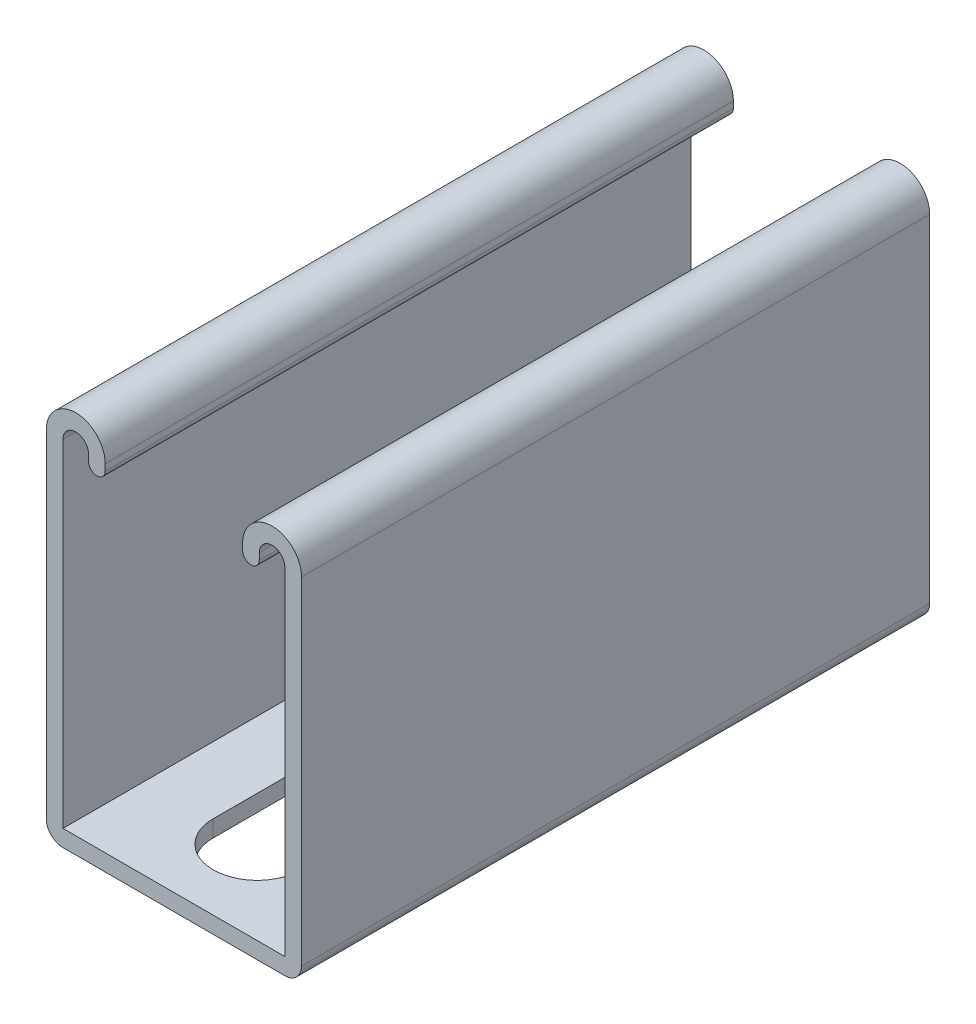
ISO-10303-21;
HEADER;
FILE_DESCRIPTION(('STEP AP214'),'2;1');
FILE_NAME('part.step','',(''),(''),'','','');
FILE_SCHEMA(('AUTOMOTIVE_DESIGN { 1 0 10303 214 1 1 1 1 }'));
ENDSEC;
DATA;
#1=APPLICATION_CONTEXT('core data for automotive mechanical design processes');
#2=APPLICATION_PROTOCOL_DEFINITION('international standard','automotive_design',2000,#1);
#3=PRODUCT_CONTEXT('',#1,'mechanical');
#4=PRODUCT('Part','Part','',(#3));
#5=PRODUCT_RELATED_PRODUCT_CATEGORY('part','',(#4));
#6=PRODUCT_DEFINITION_FORMATION('','',#4);
#7=PRODUCT_DEFINITION_CONTEXT('part definition',#1,'design');
#8=PRODUCT_DEFINITION('design','',#6,#7);
#9=PRODUCT_DEFINITION_SHAPE('','',#8);
#10=(LENGTH_UNIT() NAMED_UNIT(*) SI_UNIT(.MILLI.,.METRE.));
#11=(NAMED_UNIT(*) PLANE_ANGLE_UNIT() SI_UNIT($,.RADIAN.));
#12=(NAMED_UNIT(*) SI_UNIT($,.STERADIAN.) SOLID_ANGLE_UNIT());
#13=UNCERTAINTY_MEASURE_WITH_UNIT(LENGTH_MEASURE(1.E-05),#10,'distance_accuracy_value','');
#14=(GEOMETRIC_REPRESENTATION_CONTEXT(3) GLOBAL_UNCERTAINTY_ASSIGNED_CONTEXT((#13)) GLOBAL_UNIT_ASSIGNED_CONTEXT((#10,
#11,#12)) REPRESENTATION_CONTEXT('',''));
#15=CARTESIAN_POINT('',(0.,0.,0.));
#16=DIRECTION('',(0.,0.,1.));
#17=DIRECTION('',(1.,0.,0.));
#18=AXIS2_PLACEMENT_3D('',#15,#16,#17);
#19=CARTESIAN_POINT('',(-15.875,29.1719,101.6));
#20=DIRECTION('',(0.,0.,-1.));
#21=DIRECTION('',(-1.,0.,0.));
#22=AXIS2_PLACEMENT_3D('',#19,#20,#21);
#23=CYLINDRICAL_SURFACE('',#22,4.7625);
#24=CARTESIAN_POINT('',(-15.875,29.1719,0.));
#25=DIRECTION('',(0.,0.,1.));
#26=DIRECTION('',(-1.,0.,0.));
#27=AXIS2_PLACEMENT_3D('',#24,#25,#26);
#28=CIRCLE('',#27,4.7625);
#29=CARTESIAN_POINT('',(-11.1125,29.1719,0.));
#30=VERTEX_POINT('',#29);
#31=CARTESIAN_POINT('',(-20.6375,29.1719,0.));
#32=VERTEX_POINT('',#31);
#33=EDGE_CURVE('E253',#30,#32,#28,.T.);
#34=ORIENTED_EDGE('',*,*,#33,.T.);
#35=DIRECTION('',(0.,0.,-1.));
#36=VECTOR('',#35,1.);
#37=CARTESIAN_POINT('',(-20.6375,29.1719,101.6));
#38=LINE('',#37,#36);
#39=CARTESIAN_POINT('',(-20.6375,29.1719,101.6));
#40=VERTEX_POINT('',#39);
#41=EDGE_CURVE('E384',#40,#32,#38,.T.);
#42=ORIENTED_EDGE('',*,*,#41,.F.);
#43=CARTESIAN_POINT('',(-15.875,29.1719,101.6));
#44=DIRECTION('',(0.,0.,1.));
#45=DIRECTION('',(-1.,0.,0.));
#46=AXIS2_PLACEMENT_3D('',#43,#44,#45);
#47=CIRCLE('',#46,4.7625);
#48=CARTESIAN_POINT('',(-11.1125,29.1719,101.6));
#49=VERTEX_POINT('',#48);
#50=EDGE_CURVE('E260',#49,#40,#47,.T.);
#51=ORIENTED_EDGE('',*,*,#50,.F.);
#52=DIRECTION('',(0.,0.,-1.));
#53=VECTOR('',#52,1.);
#54=CARTESIAN_POINT('',(-11.1125,29.1719,101.6));
#55=LINE('',#54,#53);
#56=EDGE_CURVE('E298',#49,#30,#55,.T.);
#57=ORIENTED_EDGE('',*,*,#56,.T.);
#58=EDGE_LOOP('',(#34,#42,#51,#57));
#59=FACE_BOUND('',#58,.T.);
#60=ADVANCED_FACE('F32',(#59),#23,.T.);
#61=CARTESIAN_POINT('',(-20.6375,29.1719,101.6));
#62=DIRECTION('',(1.,0.,0.));
#63=DIRECTION('',(0.,1.,0.));
#64=AXIS2_PLACEMENT_3D('',#61,#62,#63);
#65=PLANE('',#64);
#66=DIRECTION('',(0.,-1.,0.));
#67=VECTOR('',#66,1.);
#68=CARTESIAN_POINT('',(-20.6375,29.1719,0.));
#69=LINE('',#68,#67);
#70=CARTESIAN_POINT('',(-20.6375,-25.3238,0.));
#71=VERTEX_POINT('',#70);
#72=EDGE_CURVE('E301',#32,#71,#69,.T.);
#73=ORIENTED_EDGE('',*,*,#72,.T.);
#74=DIRECTION('',(0.,0.,-1.));
#75=VECTOR('',#74,1.);
#76=CARTESIAN_POINT('',(-20.6375,-25.3238,101.6));
#77=LINE('',#76,#75);
#78=CARTESIAN_POINT('',(-20.6375,-25.3238,101.6));
#79=VERTEX_POINT('',#78);
#80=EDGE_CURVE('E381',#79,#71,#77,.T.);
#81=ORIENTED_EDGE('',*,*,#80,.F.);
#82=DIRECTION('',(0.,-1.,0.));
#83=VECTOR('',#82,1.);
#84=CARTESIAN_POINT('',(-20.6375,29.1719,101.6));
#85=LINE('',#84,#83);
#86=EDGE_CURVE('E263',#40,#79,#85,.T.);
#87=ORIENTED_EDGE('',*,*,#86,.F.);
#88=ORIENTED_EDGE('',*,*,#41,.T.);
#89=EDGE_LOOP('',(#73,#81,#87,#88));
#90=FACE_BOUND('',#89,.T.);
#91=ADVANCED_FACE('F425',(#90),#65,.F.);
#92=CARTESIAN_POINT('',(-17.9451,-25.3238,101.6));
#93=DIRECTION('',(0.,0.,-1.));
#94=DIRECTION('',(-1.,0.,0.));
#95=AXIS2_PLACEMENT_3D('',#92,#93,#94);
#96=CYLINDRICAL_SURFACE('',#95,2.6924);
#97=CARTESIAN_POINT('',(-17.9451,-25.3238,0.));
#98=DIRECTION('',(0.,0.,1.));
#99=DIRECTION('',(-1.,0.,0.));
#100=AXIS2_PLACEMENT_3D('',#97,#98,#99);
#101=CIRCLE('',#100,2.6924);
#102=CARTESIAN_POINT('',(-17.9451,-28.0162,0.));
#103=VERTEX_POINT('',#102);
#104=EDGE_CURVE('E303',#71,#103,#101,.T.);
#105=ORIENTED_EDGE('',*,*,#104,.T.);
#106=DIRECTION('',(0.,0.,-1.));
#107=VECTOR('',#106,1.);
#108=CARTESIAN_POINT('',(-17.9451,-28.0162,101.6));
#109=LINE('',#108,#107);
#110=CARTESIAN_POINT('',(-17.9451,-28.0162,101.6));
#111=VERTEX_POINT('',#110);
#112=EDGE_CURVE('E378',#111,#103,#109,.T.);
#113=ORIENTED_EDGE('',*,*,#112,.F.);
#114=CARTESIAN_POINT('',(-17.9451,-25.3238,101.6));
#115=DIRECTION('',(0.,0.,1.));
#116=DIRECTION('',(-1.,0.,0.));
#117=AXIS2_PLACEMENT_3D('',#114,#115,#116);
#118=CIRCLE('',#117,2.6924);
#119=EDGE_CURVE('E266',#79,#111,#118,.T.);
#120=ORIENTED_EDGE('',*,*,#119,.F.);
#121=ORIENTED_EDGE('',*,*,#80,.T.);
#122=EDGE_LOOP('',(#105,#113,#120,#121));
#123=FACE_BOUND('',#122,.T.);
#124=ADVANCED_FACE('F430',(#123),#96,.T.);
#125=CARTESIAN_POINT('',(-17.9451,-28.0162,101.6));
#126=DIRECTION('',(0.,1.,0.));
#127=DIRECTION('',(-1.,0.,0.));
#128=AXIS2_PLACEMENT_3D('',#125,#126,#127);
#129=PLANE('',#128);
#130=DIRECTION('',(0.,0.,-1.));
#131=VECTOR('',#130,1.);
#132=CARTESIAN_POINT('',(-7.14375,-28.0162000000246,73.81875));
#133=LINE('',#132,#131);
#134=CARTESIAN_POINT('',(-7.14375,-28.0162,88.10625));
#135=VERTEX_POINT('',#134);
#136=CARTESIAN_POINT('',(-7.14375,-28.0162000000246,73.81875));
#137=VERTEX_POINT('',#136);
#138=EDGE_CURVE('E206',#135,#137,#133,.T.);
#139=ORIENTED_EDGE('',*,*,#138,.F.);
#140=CARTESIAN_POINT('',(0.,-28.0162000000246,88.10625));
#141=DIRECTION('',(0.,-1.,0.));
#142=DIRECTION('',(1.,0.,0.));
#143=AXIS2_PLACEMENT_3D('',#140,#141,#142);
#144=CIRCLE('',#143,7.14375);
#145=CARTESIAN_POINT('',(7.14375,-28.0162000000246,88.10625));
#146=VERTEX_POINT('',#145);
#147=EDGE_CURVE('E46',#146,#135,#144,.T.);
#148=ORIENTED_EDGE('',*,*,#147,.F.);
#149=DIRECTION('',(0.,0.,1.));
#150=VECTOR('',#149,1.);
#151=CARTESIAN_POINT('',(7.14375,-28.0162000000246,88.10625));
#152=LINE('',#151,#150);
#153=CARTESIAN_POINT('',(7.14375000000001,-28.0162000000246,73.81875));
#154=VERTEX_POINT('',#153);
#155=EDGE_CURVE('E222',#154,#146,#152,.T.);
#156=ORIENTED_EDGE('',*,*,#155,.F.);
#157=CARTESIAN_POINT('',(0.,-28.0162000000246,73.81875));
#158=DIRECTION('',(0.,-1.,0.));
#159=DIRECTION('',(1.,0.,0.));
#160=AXIS2_PLACEMENT_3D('',#157,#158,#159);
#161=CIRCLE('',#160,7.14375);
#162=EDGE_CURVE('E216',#137,#154,#161,.T.);
#163=ORIENTED_EDGE('',*,*,#162,.F.);
#164=EDGE_LOOP('',(#139,#148,#156,#163));
#165=FACE_BOUND('',#164,.T.);
#166=DIRECTION('',(0.,0.,-1.));
#167=VECTOR('',#166,1.);
#168=CARTESIAN_POINT('',(-7.14375,-28.0162000000246,23.01875));
#169=LINE('',#168,#167);
#170=CARTESIAN_POINT('',(-7.14375,-28.0162,37.30625));
#171=VERTEX_POINT('',#170);
#172=CARTESIAN_POINT('',(-7.14375,-28.0162000000246,23.01875));
#173=VERTEX_POINT('',#172);
#174=EDGE_CURVE('E241',#171,#173,#169,.T.);
#175=ORIENTED_EDGE('',*,*,#174,.F.);
#176=CARTESIAN_POINT('',(0.,-28.0162000000246,37.30625));
#177=DIRECTION('',(0.,-1.,0.));
#178=DIRECTION('',(1.,0.,0.));
#179=AXIS2_PLACEMENT_3D('',#176,#177,#178);
#180=CIRCLE('',#179,7.14375);
#181=CARTESIAN_POINT('',(7.14375,-28.0162000000246,37.30625));
#182=VERTEX_POINT('',#181);
#183=EDGE_CURVE('E239',#182,#171,#180,.T.);
#184=ORIENTED_EDGE('',*,*,#183,.F.);
#185=DIRECTION('',(0.,0.,1.));
#186=VECTOR('',#185,1.);
#187=CARTESIAN_POINT('',(7.14375,-28.0162000000246,37.30625));
#188=LINE('',#187,#186);
#189=CARTESIAN_POINT('',(7.14375000000001,-28.0162000000246,23.01875));
#190=VERTEX_POINT('',#189);
#191=EDGE_CURVE('E247',#190,#182,#188,.T.);
#192=ORIENTED_EDGE('',*,*,#191,.F.);
#193=CARTESIAN_POINT('',(0.,-28.0162000000246,23.01875));
#194=DIRECTION('',(0.,-1.,0.));
#195=DIRECTION('',(1.,0.,0.));
#196=AXIS2_PLACEMENT_3D('',#193,#194,#195);
#197=CIRCLE('',#196,7.14375);
#198=EDGE_CURVE('E244',#173,#190,#197,.T.);
#199=ORIENTED_EDGE('',*,*,#198,.F.);
#200=EDGE_LOOP('',(#175,#184,#192,#199));
#201=FACE_BOUND('',#200,.T.);
#202=DIRECTION('',(1.,0.,0.));
#203=VECTOR('',#202,1.);
#204=CARTESIAN_POINT('',(-17.9451,-28.0162,0.));
#205=LINE('',#204,#203);
#206=CARTESIAN_POINT('',(17.9451,-28.0162,0.));
#207=VERTEX_POINT('',#206);
#208=EDGE_CURVE('E305',#103,#207,#205,.T.);
#209=ORIENTED_EDGE('',*,*,#208,.T.);
#210=DIRECTION('',(0.,0.,-1.));
#211=VECTOR('',#210,1.);
#212=CARTESIAN_POINT('',(17.9451,-28.0162,101.6));
#213=LINE('',#212,#211);
#214=CARTESIAN_POINT('',(17.9451,-28.0162,101.6));
#215=VERTEX_POINT('',#214);
#216=EDGE_CURVE('E375',#215,#207,#213,.T.);
#217=ORIENTED_EDGE('',*,*,#216,.F.);
#218=DIRECTION('',(1.,0.,0.));
#219=VECTOR('',#218,1.);
#220=CARTESIAN_POINT('',(-17.9451,-28.0162,101.6));
#221=LINE('',#220,#219);
#222=EDGE_CURVE('E268',#111,#215,#221,.T.);
#223=ORIENTED_EDGE('',*,*,#222,.F.);
#224=ORIENTED_EDGE('',*,*,#112,.T.);
#225=EDGE_LOOP('',(#209,#217,#223,#224));
#226=FACE_BOUND('',#225,.T.);
#227=ADVANCED_FACE('F220',(#165,#201,#226),#129,.F.);
#228=CARTESIAN_POINT('',(17.9451,-25.3238,101.6));
#229=DIRECTION('',(0.,0.,-1.));
#230=DIRECTION('',(-1.,0.,0.));
#231=AXIS2_PLACEMENT_3D('',#228,#229,#230);
#232=CYLINDRICAL_SURFACE('',#231,2.6924);
#233=CARTESIAN_POINT('',(17.9451,-25.3238,0.));
#234=DIRECTION('',(0.,0.,1.));
#235=DIRECTION('',(1.,0.,0.));
#236=AXIS2_PLACEMENT_3D('',#233,#234,#235);
#237=CIRCLE('',#236,2.6924);
#238=CARTESIAN_POINT('',(20.6375,-25.3238,0.));
#239=VERTEX_POINT('',#238);
#240=EDGE_CURVE('E307',#207,#239,#237,.T.);
#241=ORIENTED_EDGE('',*,*,#240,.T.);
#242=DIRECTION('',(0.,0.,-1.));
#243=VECTOR('',#242,1.);
#244=CARTESIAN_POINT('',(20.6375,-25.3238,101.6));
#245=LINE('',#244,#243);
#246=CARTESIAN_POINT('',(20.6375,-25.3238,101.6));
#247=VERTEX_POINT('',#246);
#248=EDGE_CURVE('E372',#247,#239,#245,.T.);
#249=ORIENTED_EDGE('',*,*,#248,.F.);
#250=CARTESIAN_POINT('',(17.9451,-25.3238,101.6));
#251=DIRECTION('',(0.,0.,1.));
#252=DIRECTION('',(1.,0.,0.));
#253=AXIS2_PLACEMENT_3D('',#250,#251,#252);
#254=CIRCLE('',#253,2.6924);
#255=EDGE_CURVE('E270',#215,#247,#254,.T.);
#256=ORIENTED_EDGE('',*,*,#255,.F.);
#257=ORIENTED_EDGE('',*,*,#216,.T.);
#258=EDGE_LOOP('',(#241,#249,#256,#257));
#259=FACE_BOUND('',#258,.T.);
#260=ADVANCED_FACE('F510',(#259),#232,.T.);
#261=CARTESIAN_POINT('',(20.6375,-25.3238,101.6));
#262=DIRECTION('',(-1.,0.,0.));
#263=DIRECTION('',(0.,-1.,0.));
#264=AXIS2_PLACEMENT_3D('',#261,#262,#263);
#265=PLANE('',#264);
#266=DIRECTION('',(0.,1.,0.));
#267=VECTOR('',#266,1.);
#268=CARTESIAN_POINT('',(20.6375,-25.3238,0.));
#269=LINE('',#268,#267);
#270=CARTESIAN_POINT('',(20.6375,29.1719,0.));
#271=VERTEX_POINT('',#270);
#272=EDGE_CURVE('E309',#239,#271,#269,.T.);
#273=ORIENTED_EDGE('',*,*,#272,.T.);
#274=DIRECTION('',(0.,0.,-1.));
#275=VECTOR('',#274,1.);
#276=CARTESIAN_POINT('',(20.6375,29.1719,101.6));
#277=LINE('',#276,#275);
#278=CARTESIAN_POINT('',(20.6375,29.1719,101.6));
#279=VERTEX_POINT('',#278);
#280=EDGE_CURVE('E369',#279,#271,#277,.T.);
#281=ORIENTED_EDGE('',*,*,#280,.F.);
#282=DIRECTION('',(0.,1.,0.));
#283=VECTOR('',#282,1.);
#284=CARTESIAN_POINT('',(20.6375,-25.3238,101.6));
#285=LINE('',#284,#283);
#286=EDGE_CURVE('E272',#247,#279,#285,.T.);
#287=ORIENTED_EDGE('',*,*,#286,.F.);
#288=ORIENTED_EDGE('',*,*,#248,.T.);
#289=EDGE_LOOP('',(#273,#281,#287,#288));
#290=FACE_BOUND('',#289,.T.);
#291=ADVANCED_FACE('F506',(#290),#265,.F.);
#292=CARTESIAN_POINT('',(15.875,29.1719,101.6));
#293=DIRECTION('',(0.,0.,-1.));
#294=DIRECTION('',(-1.,0.,0.));
#295=AXIS2_PLACEMENT_3D('',#292,#293,#294);
#296=CYLINDRICAL_SURFACE('',#295,4.7625);
#297=CARTESIAN_POINT('',(15.875,29.1719,0.));
#298=DIRECTION('',(0.,0.,1.));
#299=DIRECTION('',(1.,0.,0.));
#300=AXIS2_PLACEMENT_3D('',#297,#298,#299);
#301=CIRCLE('',#300,4.7625);
#302=CARTESIAN_POINT('',(11.1125,29.1719,0.));
#303=VERTEX_POINT('',#302);
#304=EDGE_CURVE('E311',#271,#303,#301,.T.);
#305=ORIENTED_EDGE('',*,*,#304,.T.);
#306=DIRECTION('',(0.,0.,-1.));
#307=VECTOR('',#306,1.);
#308=CARTESIAN_POINT('',(11.1125,29.1719,101.6));
#309=LINE('',#308,#307);
#310=CARTESIAN_POINT('',(11.1125,29.1719,101.6));
#311=VERTEX_POINT('',#310);
#312=EDGE_CURVE('E366',#311,#303,#309,.T.);
#313=ORIENTED_EDGE('',*,*,#312,.F.);
#314=CARTESIAN_POINT('',(15.875,29.1719,101.6));
#315=DIRECTION('',(0.,0.,1.));
#316=DIRECTION('',(1.,0.,0.));
#317=AXIS2_PLACEMENT_3D('',#314,#315,#316);
#318=CIRCLE('',#317,4.7625);
#319=EDGE_CURVE('E274',#279,#311,#318,.T.);
#320=ORIENTED_EDGE('',*,*,#319,.F.);
#321=ORIENTED_EDGE('',*,*,#280,.T.);
#322=EDGE_LOOP('',(#305,#313,#320,#321));
#323=FACE_BOUND('',#322,.T.);
#324=ADVANCED_FACE('F501',(#323),#296,.T.);
#325=CARTESIAN_POINT('',(11.1125,29.1719,101.6));
#326=DIRECTION('',(1.,0.,0.));
#327=DIRECTION('',(0.,1.,0.));
#328=AXIS2_PLACEMENT_3D('',#325,#326,#327);
#329=PLANE('',#328);
#330=DIRECTION('',(0.,-1.,0.));
#331=VECTOR('',#330,1.);
#332=CARTESIAN_POINT('',(11.1125,29.1719,0.));
#333=LINE('',#332,#331);
#334=CARTESIAN_POINT('',(11.1125,28.13685,0.));
#335=VERTEX_POINT('',#334);
#336=EDGE_CURVE('E313',#303,#335,#333,.T.);
#337=ORIENTED_EDGE('',*,*,#336,.T.);
#338=DIRECTION('',(0.,0.,-1.));
#339=VECTOR('',#338,1.);
#340=CARTESIAN_POINT('',(11.1125,28.13685,101.6));
#341=LINE('',#340,#339);
#342=CARTESIAN_POINT('',(11.1125,28.13685,101.6));
#343=VERTEX_POINT('',#342);
#344=EDGE_CURVE('E363',#343,#335,#341,.T.);
#345=ORIENTED_EDGE('',*,*,#344,.F.);
#346=DIRECTION('',(0.,-1.,0.));
#347=VECTOR('',#346,1.);
#348=CARTESIAN_POINT('',(11.1125,29.1719,101.6));
#349=LINE('',#348,#347);
#350=EDGE_CURVE('E276',#311,#343,#349,.T.);
#351=ORIENTED_EDGE('',*,*,#350,.F.);
#352=ORIENTED_EDGE('',*,*,#312,.T.);
#353=EDGE_LOOP('',(#337,#345,#351,#352));
#354=FACE_BOUND('',#353,.T.);
#355=ADVANCED_FACE('F495',(#354),#329,.F.);
#356=CARTESIAN_POINT('',(12.4587,28.13685,101.6));
#357=DIRECTION('',(0.,0.,-1.));
#358=DIRECTION('',(-1.,0.,0.));
#359=AXIS2_PLACEMENT_3D('',#356,#357,#358);
#360=CYLINDRICAL_SURFACE('',#359,1.3462);
#361=CARTESIAN_POINT('',(12.4587,28.13685,0.));
#362=DIRECTION('',(0.,0.,1.));
#363=DIRECTION('',(1.,0.,0.));
#364=AXIS2_PLACEMENT_3D('',#361,#362,#363);
#365=CIRCLE('',#364,1.3462);
#366=CARTESIAN_POINT('',(13.8049,28.13685,0.));
#367=VERTEX_POINT('',#366);
#368=EDGE_CURVE('E315',#335,#367,#365,.T.);
#369=ORIENTED_EDGE('',*,*,#368,.T.);
#370=DIRECTION('',(0.,0.,-1.));
#371=VECTOR('',#370,1.);
#372=CARTESIAN_POINT('',(13.8049,28.13685,101.6));
#373=LINE('',#372,#371);
#374=CARTESIAN_POINT('',(13.8049,28.13685,101.6));
#375=VERTEX_POINT('',#374);
#376=EDGE_CURVE('E360',#375,#367,#373,.T.);
#377=ORIENTED_EDGE('',*,*,#376,.F.);
#378=CARTESIAN_POINT('',(12.4587,28.13685,101.6));
#379=DIRECTION('',(0.,0.,1.));
#380=DIRECTION('',(1.,0.,0.));
#381=AXIS2_PLACEMENT_3D('',#378,#379,#380);
#382=CIRCLE('',#381,1.3462);
#383=EDGE_CURVE('E278',#343,#375,#382,.T.);
#384=ORIENTED_EDGE('',*,*,#383,.F.);
#385=ORIENTED_EDGE('',*,*,#344,.T.);
#386=EDGE_LOOP('',(#369,#377,#384,#385));
#387=FACE_BOUND('',#386,.T.);
#388=ADVANCED_FACE('F491',(#387),#360,.T.);
#389=CARTESIAN_POINT('',(13.8049,29.1719,101.6));
#390=DIRECTION('',(-1.,0.,0.));
#391=DIRECTION('',(0.,0.,1.));
#392=AXIS2_PLACEMENT_3D('',#389,#390,#391);
#393=PLANE('',#392);
#394=DIRECTION('',(0.,1.,0.));
#395=VECTOR('',#394,1.);
#396=CARTESIAN_POINT('',(13.8049,29.1719,0.));
#397=LINE('',#396,#395);
#398=CARTESIAN_POINT('',(13.8049,29.1719,0.));
#399=VERTEX_POINT('',#398);
#400=EDGE_CURVE('E317',#367,#399,#397,.T.);
#401=ORIENTED_EDGE('',*,*,#400,.T.);
#402=DIRECTION('',(0.,0.,-1.));
#403=VECTOR('',#402,1.);
#404=CARTESIAN_POINT('',(13.8049,29.1719,101.6));
#405=LINE('',#404,#403);
#406=CARTESIAN_POINT('',(13.8049,29.1719,101.6));
#407=VERTEX_POINT('',#406);
#408=EDGE_CURVE('E357',#407,#399,#405,.T.);
#409=ORIENTED_EDGE('',*,*,#408,.F.);
#410=DIRECTION('',(0.,1.,0.));
#411=VECTOR('',#410,1.);
#412=CARTESIAN_POINT('',(13.8049,29.1719,101.6));
#413=LINE('',#412,#411);
#414=EDGE_CURVE('E280',#375,#407,#413,.T.);
#415=ORIENTED_EDGE('',*,*,#414,.F.);
#416=ORIENTED_EDGE('',*,*,#376,.T.);
#417=EDGE_LOOP('',(#401,#409,#415,#416));
#418=FACE_BOUND('',#417,.T.);
#419=ADVANCED_FACE('F486',(#418),#393,.F.);
#420=CARTESIAN_POINT('',(15.875,29.1719,101.6));
#421=DIRECTION('',(0.,0.,-1.));
#422=DIRECTION('',(-1.,0.,0.));
#423=AXIS2_PLACEMENT_3D('',#420,#421,#422);
#424=CYLINDRICAL_SURFACE('',#423,2.0701);
#425=CARTESIAN_POINT('',(15.875,29.1719,0.));
#426=DIRECTION('',(0.,0.,-1.));
#427=DIRECTION('',(1.,0.,0.));
#428=AXIS2_PLACEMENT_3D('',#425,#426,#427);
#429=CIRCLE('',#428,2.0701);
#430=CARTESIAN_POINT('',(17.9451,29.1719,0.));
#431=VERTEX_POINT('',#430);
#432=EDGE_CURVE('E319',#399,#431,#429,.T.);
#433=ORIENTED_EDGE('',*,*,#432,.T.);
#434=DIRECTION('',(0.,0.,-1.));
#435=VECTOR('',#434,1.);
#436=CARTESIAN_POINT('',(17.9451,29.1719,101.6));
#437=LINE('',#436,#435);
#438=CARTESIAN_POINT('',(17.9451,29.1719,101.6));
#439=VERTEX_POINT('',#438);
#440=EDGE_CURVE('E354',#439,#431,#437,.T.);
#441=ORIENTED_EDGE('',*,*,#440,.F.);
#442=CARTESIAN_POINT('',(15.875,29.1719,101.6));
#443=DIRECTION('',(0.,0.,-1.));
#444=DIRECTION('',(1.,0.,0.));
#445=AXIS2_PLACEMENT_3D('',#442,#443,#444);
#446=CIRCLE('',#445,2.0701);
#447=EDGE_CURVE('E282',#407,#439,#446,.T.);
#448=ORIENTED_EDGE('',*,*,#447,.F.);
#449=ORIENTED_EDGE('',*,*,#408,.T.);
#450=EDGE_LOOP('',(#433,#441,#448,#449));
#451=FACE_BOUND('',#450,.T.);
#452=ADVANCED_FACE('F480',(#451),#424,.F.);
#453=CARTESIAN_POINT('',(17.9451,-25.3238,101.6));
#454=DIRECTION('',(1.,0.,0.));
#455=DIRECTION('',(0.,0.,-1.));
#456=AXIS2_PLACEMENT_3D('',#453,#454,#455);
#457=PLANE('',#456);
#458=DIRECTION('',(0.,-1.,0.));
#459=VECTOR('',#458,1.);
#460=CARTESIAN_POINT('',(17.9451,-25.3238,0.));
#461=LINE('',#460,#459);
#462=CARTESIAN_POINT('',(17.9451,-25.3238,0.));
#463=VERTEX_POINT('',#462);
#464=EDGE_CURVE('E321',#431,#463,#461,.T.);
#465=ORIENTED_EDGE('',*,*,#464,.T.);
#466=DIRECTION('',(0.,0.,-1.));
#467=VECTOR('',#466,1.);
#468=CARTESIAN_POINT('',(17.9451,-25.3238,101.6));
#469=LINE('',#468,#467);
#470=CARTESIAN_POINT('',(17.9451,-25.3238,101.6));
#471=VERTEX_POINT('',#470);
#472=EDGE_CURVE('E351',#471,#463,#469,.T.);
#473=ORIENTED_EDGE('',*,*,#472,.F.);
#474=DIRECTION('',(0.,-1.,0.));
#475=VECTOR('',#474,1.);
#476=CARTESIAN_POINT('',(17.9451,-25.3238,101.6));
#477=LINE('',#476,#475);
#478=EDGE_CURVE('E284',#439,#471,#477,.T.);
#479=ORIENTED_EDGE('',*,*,#478,.F.);
#480=ORIENTED_EDGE('',*,*,#440,.T.);
#481=EDGE_LOOP('',(#465,#473,#479,#480));
#482=FACE_BOUND('',#481,.T.);
#483=ADVANCED_FACE('F476',(#482),#457,.F.);
#484=CARTESIAN_POINT('',(-17.9451,-25.3238,101.6));
#485=DIRECTION('',(0.,-1.,0.));
#486=DIRECTION('',(0.,0.,-1.));
#487=AXIS2_PLACEMENT_3D('',#484,#485,#486);
#488=PLANE('',#487);
#489=DIRECTION('',(0.,0.,1.));
#490=VECTOR('',#489,1.);
#491=CARTESIAN_POINT('',(7.14374999999999,-25.3238,152.4));
#492=LINE('',#491,#490);
#493=CARTESIAN_POINT('',(7.14375000000001,-25.3238,73.81875));
#494=VERTEX_POINT('',#493);
#495=CARTESIAN_POINT('',(7.14375,-25.3238,88.10625));
#496=VERTEX_POINT('',#495);
#497=EDGE_CURVE('E232',#494,#496,#492,.T.);
#498=ORIENTED_EDGE('',*,*,#497,.T.);
#499=CARTESIAN_POINT('',(0.,-25.3238,88.10625));
#500=DIRECTION('',(0.,-1.,0.));
#501=DIRECTION('',(0.,0.,-1.));
#502=AXIS2_PLACEMENT_3D('',#499,#500,#501);
#503=CIRCLE('',#502,7.14375);
#504=CARTESIAN_POINT('',(-7.14375,-25.3238,88.10625));
#505=VERTEX_POINT('',#504);
#506=EDGE_CURVE('E236',#496,#505,#503,.T.);
#507=ORIENTED_EDGE('',*,*,#506,.T.);
#508=DIRECTION('',(0.,0.,-1.));
#509=VECTOR('',#508,1.);
#510=CARTESIAN_POINT('',(-7.14375,-25.3238,152.4));
#511=LINE('',#510,#509);
#512=CARTESIAN_POINT('',(-7.14375,-25.3238,73.81875));
#513=VERTEX_POINT('',#512);
#514=EDGE_CURVE('E213',#505,#513,#511,.T.);
#515=ORIENTED_EDGE('',*,*,#514,.T.);
#516=CARTESIAN_POINT('',(0.,-25.3238,73.81875));
#517=DIRECTION('',(0.,-1.,0.));
#518=DIRECTION('',(0.,0.,-1.));
#519=AXIS2_PLACEMENT_3D('',#516,#517,#518);
#520=CIRCLE('',#519,7.14375);
#521=EDGE_CURVE('E54',#513,#494,#520,.T.);
#522=ORIENTED_EDGE('',*,*,#521,.T.);
#523=EDGE_LOOP('',(#498,#507,#515,#522));
#524=FACE_BOUND('',#523,.T.);
#525=DIRECTION('',(0.,0.,1.));
#526=VECTOR('',#525,1.);
#527=CARTESIAN_POINT('',(7.14374999999999,-25.3238,101.6));
#528=LINE('',#527,#526);
#529=CARTESIAN_POINT('',(7.14375000000001,-25.3238,23.01875));
#530=VERTEX_POINT('',#529);
#531=CARTESIAN_POINT('',(7.14375,-25.3238,37.30625));
#532=VERTEX_POINT('',#531);
#533=EDGE_CURVE('E39',#530,#532,#528,.T.);
#534=ORIENTED_EDGE('',*,*,#533,.T.);
#535=CARTESIAN_POINT('',(0.,-25.3238,37.30625));
#536=DIRECTION('',(0.,-1.,0.));
#537=DIRECTION('',(0.,0.,-1.));
#538=AXIS2_PLACEMENT_3D('',#535,#536,#537);
#539=CIRCLE('',#538,7.14375);
#540=CARTESIAN_POINT('',(-7.14375,-25.3238,37.30625));
#541=VERTEX_POINT('',#540);
#542=EDGE_CURVE('E11',#532,#541,#539,.T.);
#543=ORIENTED_EDGE('',*,*,#542,.T.);
#544=DIRECTION('',(0.,0.,-1.));
#545=VECTOR('',#544,1.);
#546=CARTESIAN_POINT('',(-7.14375,-25.3238,101.6));
#547=LINE('',#546,#545);
#548=CARTESIAN_POINT('',(-7.14375,-25.3238,23.01875));
#549=VERTEX_POINT('',#548);
#550=EDGE_CURVE('E387',#541,#549,#547,.T.);
#551=ORIENTED_EDGE('',*,*,#550,.T.);
#552=CARTESIAN_POINT('',(0.,-25.3238,23.01875));
#553=DIRECTION('',(0.,-1.,0.));
#554=DIRECTION('',(0.,0.,-1.));
#555=AXIS2_PLACEMENT_3D('',#552,#553,#554);
#556=CIRCLE('',#555,7.14375);
#557=EDGE_CURVE('E390',#549,#530,#556,.T.);
#558=ORIENTED_EDGE('',*,*,#557,.T.);
#559=EDGE_LOOP('',(#534,#543,#551,#558));
#560=FACE_BOUND('',#559,.T.);
#561=DIRECTION('',(-1.,0.,0.));
#562=VECTOR('',#561,1.);
#563=CARTESIAN_POINT('',(-17.9451,-25.3238,0.));
#564=LINE('',#563,#562);
#565=CARTESIAN_POINT('',(-17.9451,-25.3238,0.));
#566=VERTEX_POINT('',#565);
#567=EDGE_CURVE('E323',#463,#566,#564,.T.);
#568=ORIENTED_EDGE('',*,*,#567,.T.);
#569=DIRECTION('',(0.,0.,-1.));
#570=VECTOR('',#569,1.);
#571=CARTESIAN_POINT('',(-17.9451,-25.3238,101.6));
#572=LINE('',#571,#570);
#573=CARTESIAN_POINT('',(-17.9451,-25.3238,101.6));
#574=VERTEX_POINT('',#573);
#575=EDGE_CURVE('E348',#574,#566,#572,.T.);
#576=ORIENTED_EDGE('',*,*,#575,.F.);
#577=DIRECTION('',(-1.,0.,0.));
#578=VECTOR('',#577,1.);
#579=CARTESIAN_POINT('',(-17.9451,-25.3238,101.6));
#580=LINE('',#579,#578);
#581=EDGE_CURVE('E286',#471,#574,#580,.T.);
#582=ORIENTED_EDGE('',*,*,#581,.F.);
#583=ORIENTED_EDGE('',*,*,#472,.T.);
#584=EDGE_LOOP('',(#568,#576,#582,#583));
#585=FACE_BOUND('',#584,.T.);
#586=ADVANCED_FACE('F394',(#524,#560,#585),#488,.F.);
#587=CARTESIAN_POINT('',(-17.9451,29.1719,101.6));
#588=DIRECTION('',(-1.,0.,0.));
#589=DIRECTION('',(0.,-1.,0.));
#590=AXIS2_PLACEMENT_3D('',#587,#588,#589);
#591=PLANE('',#590);
#592=DIRECTION('',(0.,1.,0.));
#593=VECTOR('',#592,1.);
#594=CARTESIAN_POINT('',(-17.9451,29.1719,0.));
#595=LINE('',#594,#593);
#596=CARTESIAN_POINT('',(-17.9451,29.1719,0.));
#597=VERTEX_POINT('',#596);
#598=EDGE_CURVE('E325',#566,#597,#595,.T.);
#599=ORIENTED_EDGE('',*,*,#598,.T.);
#600=DIRECTION('',(0.,0.,-1.));
#601=VECTOR('',#600,1.);
#602=CARTESIAN_POINT('',(-17.9451,29.1719,101.6));
#603=LINE('',#602,#601);
#604=CARTESIAN_POINT('',(-17.9451,29.1719,101.6));
#605=VERTEX_POINT('',#604);
#606=EDGE_CURVE('E345',#605,#597,#603,.T.);
#607=ORIENTED_EDGE('',*,*,#606,.F.);
#608=DIRECTION('',(0.,1.,0.));
#609=VECTOR('',#608,1.);
#610=CARTESIAN_POINT('',(-17.9451,29.1719,101.6));
#611=LINE('',#610,#609);
#612=EDGE_CURVE('E288',#574,#605,#611,.T.);
#613=ORIENTED_EDGE('',*,*,#612,.F.);
#614=ORIENTED_EDGE('',*,*,#575,.T.);
#615=EDGE_LOOP('',(#599,#607,#613,#614));
#616=FACE_BOUND('',#615,.T.);
#617=ADVANCED_FACE('F467',(#616),#591,.F.);
#618=CARTESIAN_POINT('',(-15.875,29.1719,101.6));
#619=DIRECTION('',(0.,0.,-1.));
#620=DIRECTION('',(-1.,0.,0.));
#621=AXIS2_PLACEMENT_3D('',#618,#619,#620);
#622=CYLINDRICAL_SURFACE('',#621,2.0701);
#623=CARTESIAN_POINT('',(-15.875,29.1719,0.));
#624=DIRECTION('',(0.,0.,-1.));
#625=DIRECTION('',(-1.,0.,0.));
#626=AXIS2_PLACEMENT_3D('',#623,#624,#625);
#627=CIRCLE('',#626,2.0701);
#628=CARTESIAN_POINT('',(-13.8049,29.1719,0.));
#629=VERTEX_POINT('',#628);
#630=EDGE_CURVE('E327',#597,#629,#627,.T.);
#631=ORIENTED_EDGE('',*,*,#630,.T.);
#632=DIRECTION('',(0.,0.,-1.));
#633=VECTOR('',#632,1.);
#634=CARTESIAN_POINT('',(-13.8049,29.1719,101.6));
#635=LINE('',#634,#633);
#636=CARTESIAN_POINT('',(-13.8049,29.1719,101.6));
#637=VERTEX_POINT('',#636);
#638=EDGE_CURVE('E342',#637,#629,#635,.T.);
#639=ORIENTED_EDGE('',*,*,#638,.F.);
#640=CARTESIAN_POINT('',(-15.875,29.1719,101.6));
#641=DIRECTION('',(0.,0.,-1.));
#642=DIRECTION('',(-1.,0.,0.));
#643=AXIS2_PLACEMENT_3D('',#640,#641,#642);
#644=CIRCLE('',#643,2.0701);
#645=EDGE_CURVE('E290',#605,#637,#644,.T.);
#646=ORIENTED_EDGE('',*,*,#645,.F.);
#647=ORIENTED_EDGE('',*,*,#606,.T.);
#648=EDGE_LOOP('',(#631,#639,#646,#647));
#649=FACE_BOUND('',#648,.T.);
#650=ADVANCED_FACE('F463',(#649),#622,.F.);
#651=CARTESIAN_POINT('',(-13.8049,29.1719,101.6));
#652=DIRECTION('',(1.,0.,0.));
#653=DIRECTION('',(0.,0.,-1.));
#654=AXIS2_PLACEMENT_3D('',#651,#652,#653);
#655=PLANE('',#654);
#656=DIRECTION('',(0.,-1.,0.));
#657=VECTOR('',#656,1.);
#658=CARTESIAN_POINT('',(-13.8049,29.1719,0.));
#659=LINE('',#658,#657);
#660=CARTESIAN_POINT('',(-13.8049,28.13685,0.));
#661=VERTEX_POINT('',#660);
#662=EDGE_CURVE('E329',#629,#661,#659,.T.);
#663=ORIENTED_EDGE('',*,*,#662,.T.);
#664=DIRECTION('',(0.,0.,-1.));
#665=VECTOR('',#664,1.);
#666=CARTESIAN_POINT('',(-13.8049,28.13685,101.6));
#667=LINE('',#666,#665);
#668=CARTESIAN_POINT('',(-13.8049,28.13685,101.6));
#669=VERTEX_POINT('',#668);
#670=EDGE_CURVE('E339',#669,#661,#667,.T.);
#671=ORIENTED_EDGE('',*,*,#670,.F.);
#672=DIRECTION('',(0.,-1.,0.));
#673=VECTOR('',#672,1.);
#674=CARTESIAN_POINT('',(-13.8049,29.1719,101.6));
#675=LINE('',#674,#673);
#676=EDGE_CURVE('E292',#637,#669,#675,.T.);
#677=ORIENTED_EDGE('',*,*,#676,.F.);
#678=ORIENTED_EDGE('',*,*,#638,.T.);
#679=EDGE_LOOP('',(#663,#671,#677,#678));
#680=FACE_BOUND('',#679,.T.);
#681=ADVANCED_FACE('F458',(#680),#655,.F.);
#682=CARTESIAN_POINT('',(-12.4587,28.13685,101.6));
#683=DIRECTION('',(0.,0.,-1.));
#684=DIRECTION('',(-1.,0.,0.));
#685=AXIS2_PLACEMENT_3D('',#682,#683,#684);
#686=CYLINDRICAL_SURFACE('',#685,1.3462);
#687=CARTESIAN_POINT('',(-12.4587,28.13685,0.));
#688=DIRECTION('',(0.,0.,1.));
#689=DIRECTION('',(-1.,0.,0.));
#690=AXIS2_PLACEMENT_3D('',#687,#688,#689);
#691=CIRCLE('',#690,1.3462);
#692=CARTESIAN_POINT('',(-11.1125,28.13685,0.));
#693=VERTEX_POINT('',#692);
#694=EDGE_CURVE('E331',#661,#693,#691,.T.);
#695=ORIENTED_EDGE('',*,*,#694,.T.);
#696=DIRECTION('',(0.,0.,-1.));
#697=VECTOR('',#696,1.);
#698=CARTESIAN_POINT('',(-11.1125,28.13685,101.6));
#699=LINE('',#698,#697);
#700=CARTESIAN_POINT('',(-11.1125,28.13685,101.6));
#701=VERTEX_POINT('',#700);
#702=EDGE_CURVE('E336',#701,#693,#699,.T.);
#703=ORIENTED_EDGE('',*,*,#702,.F.);
#704=CARTESIAN_POINT('',(-12.4587,28.13685,101.6));
#705=DIRECTION('',(0.,0.,1.));
#706=DIRECTION('',(-1.,0.,0.));
#707=AXIS2_PLACEMENT_3D('',#704,#705,#706);
#708=CIRCLE('',#707,1.3462);
#709=EDGE_CURVE('E294',#669,#701,#708,.T.);
#710=ORIENTED_EDGE('',*,*,#709,.F.);
#711=ORIENTED_EDGE('',*,*,#670,.T.);
#712=EDGE_LOOP('',(#695,#703,#710,#711));
#713=FACE_BOUND('',#712,.T.);
#714=ADVANCED_FACE('F452',(#713),#686,.T.);
#715=CARTESIAN_POINT('',(-11.1125,29.1719,101.6));
#716=DIRECTION('',(-1.,0.,0.));
#717=DIRECTION('',(0.,-1.,0.));
#718=AXIS2_PLACEMENT_3D('',#715,#716,#717);
#719=PLANE('',#718);
#720=DIRECTION('',(0.,1.,0.));
#721=VECTOR('',#720,1.);
#722=CARTESIAN_POINT('',(-11.1125,29.1719,0.));
#723=LINE('',#722,#721);
#724=EDGE_CURVE('E264',#693,#30,#723,.T.);
#725=ORIENTED_EDGE('',*,*,#724,.T.);
#726=ORIENTED_EDGE('',*,*,#56,.F.);
#727=DIRECTION('',(0.,1.,0.));
#728=VECTOR('',#727,1.);
#729=CARTESIAN_POINT('',(-11.1125,29.1719,101.6));
#730=LINE('',#729,#728);
#731=EDGE_CURVE('E296',#701,#49,#730,.T.);
#732=ORIENTED_EDGE('',*,*,#731,.F.);
#733=ORIENTED_EDGE('',*,*,#702,.T.);
#734=EDGE_LOOP('',(#725,#726,#732,#733));
#735=FACE_BOUND('',#734,.T.);
#736=ADVANCED_FACE('F450',(#735),#719,.F.);
#737=CARTESIAN_POINT('',(-15.875,29.1719,101.6));
#738=DIRECTION('',(0.,0.,-1.));
#739=DIRECTION('',(-1.,0.,0.));
#740=AXIS2_PLACEMENT_3D('',#737,#738,#739);
#741=PLANE('',#740);
#742=ORIENTED_EDGE('',*,*,#50,.T.);
#743=ORIENTED_EDGE('',*,*,#86,.T.);
#744=ORIENTED_EDGE('',*,*,#119,.T.);
#745=ORIENTED_EDGE('',*,*,#222,.T.);
#746=ORIENTED_EDGE('',*,*,#255,.T.);
#747=ORIENTED_EDGE('',*,*,#286,.T.);
#748=ORIENTED_EDGE('',*,*,#319,.T.);
#749=ORIENTED_EDGE('',*,*,#350,.T.);
#750=ORIENTED_EDGE('',*,*,#383,.T.);
#751=ORIENTED_EDGE('',*,*,#414,.T.);
#752=ORIENTED_EDGE('',*,*,#447,.T.);
#753=ORIENTED_EDGE('',*,*,#478,.T.);
#754=ORIENTED_EDGE('',*,*,#581,.T.);
#755=ORIENTED_EDGE('',*,*,#612,.T.);
#756=ORIENTED_EDGE('',*,*,#645,.T.);
#757=ORIENTED_EDGE('',*,*,#676,.T.);
#758=ORIENTED_EDGE('',*,*,#709,.T.);
#759=ORIENTED_EDGE('',*,*,#731,.T.);
#760=EDGE_LOOP('',(#742,#743,#744,#745,#746,#747,#748,#749,#750,#751,#752,#753,#754,#755,#756,
#757,#758,#759));
#761=FACE_BOUND('',#760,.T.);
#762=ADVANCED_FACE('F445',(#761),#741,.F.);
#763=CARTESIAN_POINT('',(-15.875,29.1719,0.));
#764=DIRECTION('',(0.,0.,-1.));
#765=DIRECTION('',(-1.,0.,0.));
#766=AXIS2_PLACEMENT_3D('',#763,#764,#765);
#767=PLANE('',#766);
#768=ORIENTED_EDGE('',*,*,#33,.F.);
#769=ORIENTED_EDGE('',*,*,#724,.F.);
#770=ORIENTED_EDGE('',*,*,#694,.F.);
#771=ORIENTED_EDGE('',*,*,#662,.F.);
#772=ORIENTED_EDGE('',*,*,#630,.F.);
#773=ORIENTED_EDGE('',*,*,#598,.F.);
#774=ORIENTED_EDGE('',*,*,#567,.F.);
#775=ORIENTED_EDGE('',*,*,#464,.F.);
#776=ORIENTED_EDGE('',*,*,#432,.F.);
#777=ORIENTED_EDGE('',*,*,#400,.F.);
#778=ORIENTED_EDGE('',*,*,#368,.F.);
#779=ORIENTED_EDGE('',*,*,#336,.F.);
#780=ORIENTED_EDGE('',*,*,#304,.F.);
#781=ORIENTED_EDGE('',*,*,#272,.F.);
#782=ORIENTED_EDGE('',*,*,#240,.F.);
#783=ORIENTED_EDGE('',*,*,#208,.F.);
#784=ORIENTED_EDGE('',*,*,#104,.F.);
#785=ORIENTED_EDGE('',*,*,#72,.F.);
#786=EDGE_LOOP('',(#768,#769,#770,#771,#772,#773,#774,#775,#776,#777,#778,#779,#780,#781,#782,
#783,#784,#785));
#787=FACE_BOUND('',#786,.T.);
#788=ADVANCED_FACE('F438',(#787),#767,.T.);
#789=CARTESIAN_POINT('',(0.,33.9344,37.30625));
#790=DIRECTION('',(0.,-1.,0.));
#791=DIRECTION('',(1.,0.,0.));
#792=AXIS2_PLACEMENT_3D('',#789,#790,#791);
#793=CYLINDRICAL_SURFACE('',#792,7.14375);
#794=DIRECTION('',(0.,-1.,0.));
#795=VECTOR('',#794,1.);
#796=CARTESIAN_POINT('',(7.14375,33.9344,37.30625));
#797=LINE('',#796,#795);
#798=EDGE_CURVE('E251',#532,#182,#797,.T.);
#799=ORIENTED_EDGE('',*,*,#798,.T.);
#800=ORIENTED_EDGE('',*,*,#183,.T.);
#801=DIRECTION('',(0.,-1.,0.));
#802=VECTOR('',#801,1.);
#803=CARTESIAN_POINT('',(-7.14375000000001,33.9344,37.30625));
#804=LINE('',#803,#802);
#805=EDGE_CURVE('E250',#541,#171,#804,.T.);
#806=ORIENTED_EDGE('',*,*,#805,.F.);
#807=ORIENTED_EDGE('',*,*,#542,.F.);
#808=EDGE_LOOP('',(#799,#800,#806,#807));
#809=FACE_BOUND('',#808,.T.);
#810=ADVANCED_FACE('F410',(#809),#793,.F.);
#811=CARTESIAN_POINT('',(7.14375,33.9344,37.30625));
#812=DIRECTION('',(1.,0.,0.));
#813=DIRECTION('',(0.,0.,-1.));
#814=AXIS2_PLACEMENT_3D('',#811,#812,#813);
#815=PLANE('',#814);
#816=DIRECTION('',(0.,-1.,0.));
#817=VECTOR('',#816,1.);
#818=CARTESIAN_POINT('',(7.14375,33.9344,23.01875));
#819=LINE('',#818,#817);
#820=EDGE_CURVE('E254',#530,#190,#819,.T.);
#821=ORIENTED_EDGE('',*,*,#820,.T.);
#822=ORIENTED_EDGE('',*,*,#191,.T.);
#823=ORIENTED_EDGE('',*,*,#798,.F.);
#824=ORIENTED_EDGE('',*,*,#533,.F.);
#825=EDGE_LOOP('',(#821,#822,#823,#824));
#826=FACE_BOUND('',#825,.T.);
#827=ADVANCED_FACE('F400',(#826),#815,.F.);
#828=CARTESIAN_POINT('',(0.,33.9344,23.01875));
#829=DIRECTION('',(0.,-1.,0.));
#830=DIRECTION('',(1.,0.,0.));
#831=AXIS2_PLACEMENT_3D('',#828,#829,#830);
#832=CYLINDRICAL_SURFACE('',#831,7.14375);
#833=DIRECTION('',(0.,-1.,0.));
#834=VECTOR('',#833,1.);
#835=CARTESIAN_POINT('',(-7.14375000000001,33.9344,23.01875));
#836=LINE('',#835,#834);
#837=EDGE_CURVE('E256',#549,#173,#836,.T.);
#838=ORIENTED_EDGE('',*,*,#837,.T.);
#839=ORIENTED_EDGE('',*,*,#198,.T.);
#840=ORIENTED_EDGE('',*,*,#820,.F.);
#841=ORIENTED_EDGE('',*,*,#557,.F.);
#842=EDGE_LOOP('',(#838,#839,#840,#841));
#843=FACE_BOUND('',#842,.T.);
#844=ADVANCED_FACE('F402',(#843),#832,.F.);
#845=CARTESIAN_POINT('',(-7.14375000000001,33.9344,23.01875));
#846=DIRECTION('',(-1.,0.,0.));
#847=DIRECTION('',(0.,-1.,0.));
#848=AXIS2_PLACEMENT_3D('',#845,#846,#847);
#849=PLANE('',#848);
#850=ORIENTED_EDGE('',*,*,#805,.T.);
#851=ORIENTED_EDGE('',*,*,#174,.T.);
#852=ORIENTED_EDGE('',*,*,#837,.F.);
#853=ORIENTED_EDGE('',*,*,#550,.F.);
#854=EDGE_LOOP('',(#850,#851,#852,#853));
#855=FACE_BOUND('',#854,.T.);
#856=ADVANCED_FACE('F412',(#855),#849,.F.);
#857=CARTESIAN_POINT('',(0.,33.9344,88.10625));
#858=DIRECTION('',(0.,-1.,0.));
#859=DIRECTION('',(1.,0.,0.));
#860=AXIS2_PLACEMENT_3D('',#857,#858,#859);
#861=CYLINDRICAL_SURFACE('',#860,7.14375);
#862=DIRECTION('',(0.,-1.,0.));
#863=VECTOR('',#862,1.);
#864=CARTESIAN_POINT('',(7.14375,33.9344,88.10625));
#865=LINE('',#864,#863);
#866=EDGE_CURVE('E230',#496,#146,#865,.T.);
#867=ORIENTED_EDGE('',*,*,#866,.T.);
#868=ORIENTED_EDGE('',*,*,#147,.T.);
#869=DIRECTION('',(0.,-1.,0.));
#870=VECTOR('',#869,1.);
#871=CARTESIAN_POINT('',(-7.14375000000001,33.9344,88.10625));
#872=LINE('',#871,#870);
#873=EDGE_CURVE('E210',#505,#135,#872,.T.);
#874=ORIENTED_EDGE('',*,*,#873,.F.);
#875=ORIENTED_EDGE('',*,*,#506,.F.);
#876=EDGE_LOOP('',(#867,#868,#874,#875));
#877=FACE_BOUND('',#876,.T.);
#878=ADVANCED_FACE('F414',(#877),#861,.F.);
#879=CARTESIAN_POINT('',(7.14375,33.9344,88.10625));
#880=DIRECTION('',(1.,0.,0.));
#881=DIRECTION('',(0.,0.,-1.));
#882=AXIS2_PLACEMENT_3D('',#879,#880,#881);
#883=PLANE('',#882);
#884=DIRECTION('',(0.,-1.,0.));
#885=VECTOR('',#884,1.);
#886=CARTESIAN_POINT('',(7.14375,33.9344,73.81875));
#887=LINE('',#886,#885);
#888=EDGE_CURVE('E223',#494,#154,#887,.T.);
#889=ORIENTED_EDGE('',*,*,#888,.T.);
#890=ORIENTED_EDGE('',*,*,#155,.T.);
#891=ORIENTED_EDGE('',*,*,#866,.F.);
#892=ORIENTED_EDGE('',*,*,#497,.F.);
#893=EDGE_LOOP('',(#889,#890,#891,#892));
#894=FACE_BOUND('',#893,.T.);
#895=ADVANCED_FACE('F420',(#894),#883,.F.);
#896=CARTESIAN_POINT('',(0.,33.9344,73.81875));
#897=DIRECTION('',(0.,-1.,0.));
#898=DIRECTION('',(1.,0.,0.));
#899=AXIS2_PLACEMENT_3D('',#896,#897,#898);
#900=CYLINDRICAL_SURFACE('',#899,7.14375);
#901=DIRECTION('',(0.,-1.,0.));
#902=VECTOR('',#901,1.);
#903=CARTESIAN_POINT('',(-7.14375000000001,33.9344,73.81875));
#904=LINE('',#903,#902);
#905=EDGE_CURVE('E208',#513,#137,#904,.T.);
#906=ORIENTED_EDGE('',*,*,#905,.T.);
#907=ORIENTED_EDGE('',*,*,#162,.T.);
#908=ORIENTED_EDGE('',*,*,#888,.F.);
#909=ORIENTED_EDGE('',*,*,#521,.F.);
#910=EDGE_LOOP('',(#906,#907,#908,#909));
#911=FACE_BOUND('',#910,.T.);
#912=ADVANCED_FACE('F215',(#911),#900,.F.);
#913=CARTESIAN_POINT('',(-7.14375000000001,33.9344,73.81875));
#914=DIRECTION('',(-1.,0.,0.));
#915=DIRECTION('',(0.,-1.,0.));
#916=AXIS2_PLACEMENT_3D('',#913,#914,#915);
#917=PLANE('',#916);
#918=ORIENTED_EDGE('',*,*,#873,.T.);
#919=ORIENTED_EDGE('',*,*,#138,.T.);
#920=ORIENTED_EDGE('',*,*,#905,.F.);
#921=ORIENTED_EDGE('',*,*,#514,.F.);
#922=EDGE_LOOP('',(#918,#919,#920,#921));
#923=FACE_BOUND('',#922,.T.);
#924=ADVANCED_FACE('F207',(#923),#917,.F.);
#925=CLOSED_SHELL('',(#60,#91,#124,#227,#260,#291,#324,#355,#388,#419,#452,#483,#586,#617,#650,
#681,#714,#736,#762,#788,#810,#827,#844,#856,#878,#895,#912,#924));
#926=MANIFOLD_SOLID_BREP('B2',#925);
#927=ADVANCED_BREP_SHAPE_REPRESENTATION('',(#18,#926),#14);
#928=SHAPE_DEFINITION_REPRESENTATION(#9,#927);
ENDSEC;
END-ISO-10303-21;
